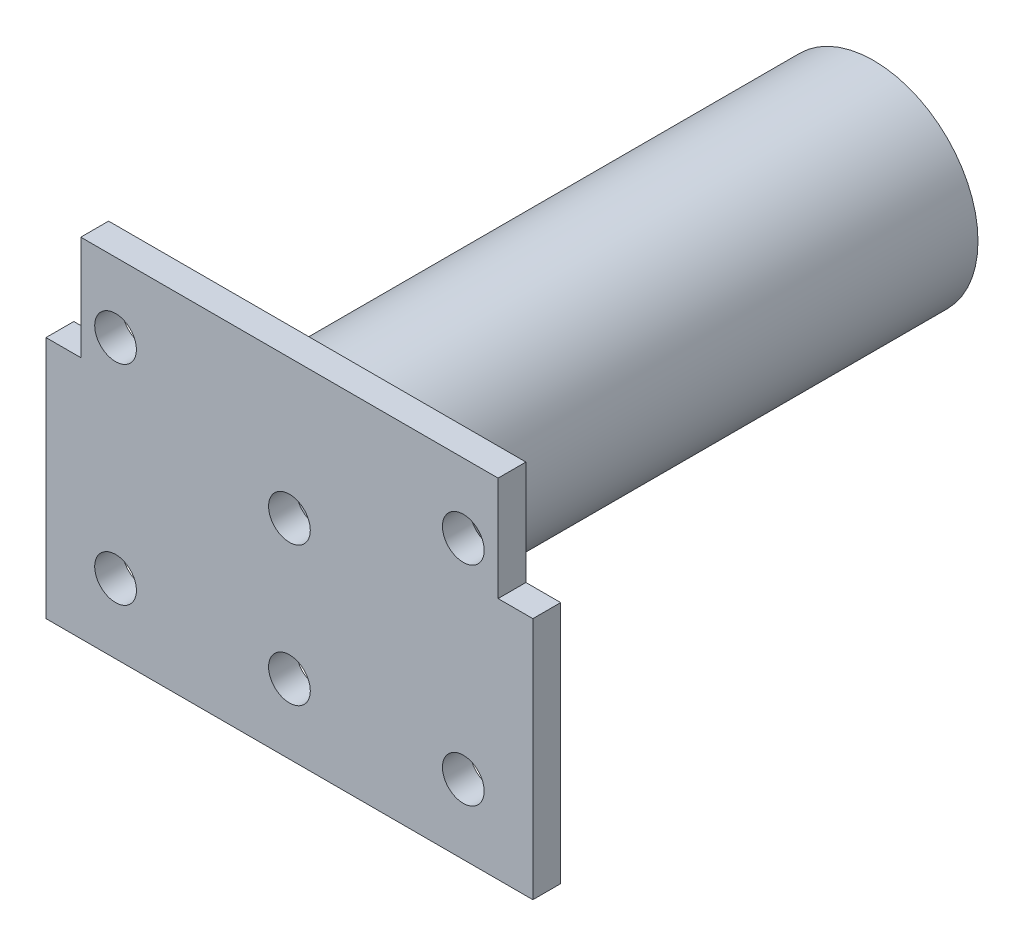
ISO-10303-21;
HEADER;
FILE_DESCRIPTION(('STEP AP214'),'2;1');
FILE_NAME('part.step','',(''),(''),'','','');
FILE_SCHEMA(('AUTOMOTIVE_DESIGN { 1 0 10303 214 1 1 1 1 }'));
ENDSEC;
DATA;
#1=APPLICATION_CONTEXT('core data for automotive mechanical design processes');
#2=APPLICATION_PROTOCOL_DEFINITION('international standard','automotive_design',2000,#1);
#3=PRODUCT_CONTEXT('',#1,'mechanical');
#4=PRODUCT('Part','Part','',(#3));
#5=PRODUCT_RELATED_PRODUCT_CATEGORY('part','',(#4));
#6=PRODUCT_DEFINITION_FORMATION('','',#4);
#7=PRODUCT_DEFINITION_CONTEXT('part definition',#1,'design');
#8=PRODUCT_DEFINITION('design','',#6,#7);
#9=PRODUCT_DEFINITION_SHAPE('','',#8);
#10=(LENGTH_UNIT() NAMED_UNIT(*) SI_UNIT(.MILLI.,.METRE.));
#11=(NAMED_UNIT(*) PLANE_ANGLE_UNIT() SI_UNIT($,.RADIAN.));
#12=(NAMED_UNIT(*) SI_UNIT($,.STERADIAN.) SOLID_ANGLE_UNIT());
#13=UNCERTAINTY_MEASURE_WITH_UNIT(LENGTH_MEASURE(1.E-05),#10,'distance_accuracy_value','');
#14=(GEOMETRIC_REPRESENTATION_CONTEXT(3) GLOBAL_UNCERTAINTY_ASSIGNED_CONTEXT((#13)) GLOBAL_UNIT_ASSIGNED_CONTEXT((#10,
#11,#12)) REPRESENTATION_CONTEXT('',''));
#15=CARTESIAN_POINT('',(0.,0.,0.));
#16=DIRECTION('',(0.,0.,1.));
#17=DIRECTION('',(1.,0.,0.));
#18=AXIS2_PLACEMENT_3D('',#15,#16,#17);
#19=CARTESIAN_POINT('',(0.,0.,4.));
#20=DIRECTION('',(0.,0.,-1.));
#21=DIRECTION('',(-1.,0.,0.));
#22=AXIS2_PLACEMENT_3D('',#19,#20,#21);
#23=PLANE('',#22);
#24=CARTESIAN_POINT('',(0.,15.,4.));
#25=DIRECTION('',(0.,0.,1.));
#26=DIRECTION('',(1.,0.,0.));
#27=AXIS2_PLACEMENT_3D('',#24,#25,#26);
#28=CIRCLE('',#27,3.);
#29=CARTESIAN_POINT('',(3.,15.,4.));
#30=VERTEX_POINT('',#29);
#31=EDGE_CURVE('E196',#30,#30,#28,.T.);
#32=ORIENTED_EDGE('',*,*,#31,.F.);
#33=EDGE_LOOP('',(#32));
#34=FACE_BOUND('',#33,.T.);
#35=CARTESIAN_POINT('',(25.,25.,4.));
#36=DIRECTION('',(0.,0.,-1.));
#37=DIRECTION('',(-1.,0.,0.));
#38=AXIS2_PLACEMENT_3D('',#35,#36,#37);
#39=CIRCLE('',#38,3.);
#40=CARTESIAN_POINT('',(22.,25.,4.));
#41=VERTEX_POINT('',#40);
#42=EDGE_CURVE('E173',#41,#41,#39,.F.);
#43=ORIENTED_EDGE('',*,*,#42,.F.);
#44=EDGE_LOOP('',(#43));
#45=FACE_BOUND('',#44,.T.);
#46=CARTESIAN_POINT('',(-25.,25.,4.));
#47=DIRECTION('',(0.,0.,-1.));
#48=DIRECTION('',(-1.,0.,0.));
#49=AXIS2_PLACEMENT_3D('',#46,#47,#48);
#50=CIRCLE('',#49,3.);
#51=CARTESIAN_POINT('',(-28.,25.,4.));
#52=VERTEX_POINT('',#51);
#53=EDGE_CURVE('E176',#52,#52,#50,.F.);
#54=ORIENTED_EDGE('',*,*,#53,.F.);
#55=EDGE_LOOP('',(#54));
#56=FACE_BOUND('',#55,.T.);
#57=DIRECTION('',(1.,0.,0.));
#58=VECTOR('',#57,1.);
#59=CARTESIAN_POINT('',(30.,20.,4.));
#60=LINE('',#59,#58);
#61=CARTESIAN_POINT('',(30.,20.,4.));
#62=VERTEX_POINT('',#61);
#63=CARTESIAN_POINT('',(35.,20.,4.));
#64=VERTEX_POINT('',#63);
#65=EDGE_CURVE('E110',#62,#64,#60,.T.);
#66=ORIENTED_EDGE('',*,*,#65,.F.);
#67=DIRECTION('',(0.,-1.,0.));
#68=VECTOR('',#67,1.);
#69=CARTESIAN_POINT('',(30.,35.,4.));
#70=LINE('',#69,#68);
#71=CARTESIAN_POINT('',(30.,35.,4.));
#72=VERTEX_POINT('',#71);
#73=EDGE_CURVE('E213',#72,#62,#70,.T.);
#74=ORIENTED_EDGE('',*,*,#73,.F.);
#75=DIRECTION('',(-1.,0.,0.));
#76=VECTOR('',#75,1.);
#77=CARTESIAN_POINT('',(35.,35.,4.));
#78=LINE('',#77,#76);
#79=CARTESIAN_POINT('',(-30.,35.,4.));
#80=VERTEX_POINT('',#79);
#81=EDGE_CURVE('E161',#72,#80,#78,.T.);
#82=ORIENTED_EDGE('',*,*,#81,.T.);
#83=DIRECTION('',(0.,1.,0.));
#84=VECTOR('',#83,1.);
#85=CARTESIAN_POINT('',(-30.,35.,4.));
#86=LINE('',#85,#84);
#87=CARTESIAN_POINT('',(-30.,20.,4.));
#88=VERTEX_POINT('',#87);
#89=EDGE_CURVE('E53',#88,#80,#86,.T.);
#90=ORIENTED_EDGE('',*,*,#89,.F.);
#91=DIRECTION('',(1.,0.,0.));
#92=VECTOR('',#91,1.);
#93=CARTESIAN_POINT('',(-30.,20.,4.));
#94=LINE('',#93,#92);
#95=CARTESIAN_POINT('',(-35.,20.,4.));
#96=VERTEX_POINT('',#95);
#97=EDGE_CURVE('E124',#96,#88,#94,.T.);
#98=ORIENTED_EDGE('',*,*,#97,.F.);
#99=DIRECTION('',(0.,-1.,0.));
#100=VECTOR('',#99,1.);
#101=CARTESIAN_POINT('',(-35.,-15.,4.));
#102=LINE('',#101,#100);
#103=CARTESIAN_POINT('',(-35.,-15.,4.));
#104=VERTEX_POINT('',#103);
#105=EDGE_CURVE('E141',#96,#104,#102,.T.);
#106=ORIENTED_EDGE('',*,*,#105,.T.);
#107=DIRECTION('',(1.,0.,0.));
#108=VECTOR('',#107,1.);
#109=CARTESIAN_POINT('',(-35.,-15.,4.));
#110=LINE('',#109,#108);
#111=CARTESIAN_POINT('',(35.,-15.,4.));
#112=VERTEX_POINT('',#111);
#113=EDGE_CURVE('E137',#104,#112,#110,.T.);
#114=ORIENTED_EDGE('',*,*,#113,.T.);
#115=DIRECTION('',(0.,1.,0.));
#116=VECTOR('',#115,1.);
#117=CARTESIAN_POINT('',(35.,-15.,4.));
#118=LINE('',#117,#116);
#119=EDGE_CURVE('E140',#112,#64,#118,.T.);
#120=ORIENTED_EDGE('',*,*,#119,.T.);
#121=EDGE_LOOP('',(#66,#74,#82,#90,#98,#106,#114,#120));
#122=FACE_BOUND('',#121,.T.);
#123=CARTESIAN_POINT('',(0.,-5.,4.));
#124=DIRECTION('',(0.,0.,1.));
#125=DIRECTION('',(1.,0.,0.));
#126=AXIS2_PLACEMENT_3D('',#123,#124,#125);
#127=CIRCLE('',#126,3.);
#128=CARTESIAN_POINT('',(3.00000000000001,-5.,4.));
#129=VERTEX_POINT('',#128);
#130=EDGE_CURVE('E129',#129,#129,#127,.T.);
#131=ORIENTED_EDGE('',*,*,#130,.F.);
#132=EDGE_LOOP('',(#131));
#133=FACE_BOUND('',#132,.T.);
#134=CARTESIAN_POINT('',(25.,-5.,4.));
#135=DIRECTION('',(0.,0.,1.));
#136=DIRECTION('',(1.,0.,0.));
#137=AXIS2_PLACEMENT_3D('',#134,#135,#136);
#138=CIRCLE('',#137,3.);
#139=CARTESIAN_POINT('',(28.,-5.,4.));
#140=VERTEX_POINT('',#139);
#141=EDGE_CURVE('E150',#140,#140,#138,.T.);
#142=ORIENTED_EDGE('',*,*,#141,.F.);
#143=EDGE_LOOP('',(#142));
#144=FACE_BOUND('',#143,.T.);
#145=CARTESIAN_POINT('',(-25.,-5.,4.));
#146=DIRECTION('',(0.,0.,1.));
#147=DIRECTION('',(1.,0.,0.));
#148=AXIS2_PLACEMENT_3D('',#145,#146,#147);
#149=CIRCLE('',#148,3.);
#150=CARTESIAN_POINT('',(-22.,-5.,4.));
#151=VERTEX_POINT('',#150);
#152=EDGE_CURVE('E155',#151,#151,#149,.T.);
#153=ORIENTED_EDGE('',*,*,#152,.F.);
#154=EDGE_LOOP('',(#153));
#155=FACE_BOUND('',#154,.T.);
#156=ADVANCED_FACE('F38',(#34,#45,#56,#122,#133,#144,#155),#23,.F.);
#157=CARTESIAN_POINT('',(0.,0.,0.));
#158=DIRECTION('',(0.,0.,-1.));
#159=DIRECTION('',(-1.,0.,0.));
#160=AXIS2_PLACEMENT_3D('',#157,#158,#159);
#161=PLANE('',#160);
#162=DIRECTION('',(0.,1.,0.));
#163=VECTOR('',#162,1.);
#164=CARTESIAN_POINT('',(30.,35.,0.));
#165=LINE('',#164,#163);
#166=CARTESIAN_POINT('',(30.,20.,0.));
#167=VERTEX_POINT('',#166);
#168=CARTESIAN_POINT('',(30.,35.,0.));
#169=VERTEX_POINT('',#168);
#170=EDGE_CURVE('E61',#167,#169,#165,.T.);
#171=ORIENTED_EDGE('',*,*,#170,.F.);
#172=DIRECTION('',(-1.,0.,0.));
#173=VECTOR('',#172,1.);
#174=CARTESIAN_POINT('',(30.,20.,0.));
#175=LINE('',#174,#173);
#176=CARTESIAN_POINT('',(35.,20.,0.));
#177=VERTEX_POINT('',#176);
#178=EDGE_CURVE('E108',#177,#167,#175,.T.);
#179=ORIENTED_EDGE('',*,*,#178,.F.);
#180=DIRECTION('',(0.,1.,0.));
#181=VECTOR('',#180,1.);
#182=CARTESIAN_POINT('',(35.,-15.,0.));
#183=LINE('',#182,#181);
#184=CARTESIAN_POINT('',(35.,-15.,0.));
#185=VERTEX_POINT('',#184);
#186=EDGE_CURVE('E122',#185,#177,#183,.T.);
#187=ORIENTED_EDGE('',*,*,#186,.F.);
#188=DIRECTION('',(1.,0.,0.));
#189=VECTOR('',#188,1.);
#190=CARTESIAN_POINT('',(-35.,-15.,0.));
#191=LINE('',#190,#189);
#192=CARTESIAN_POINT('',(-35.,-15.,0.));
#193=VERTEX_POINT('',#192);
#194=EDGE_CURVE('E131',#193,#185,#191,.T.);
#195=ORIENTED_EDGE('',*,*,#194,.F.);
#196=DIRECTION('',(0.,-1.,0.));
#197=VECTOR('',#196,1.);
#198=CARTESIAN_POINT('',(-35.,-15.,0.));
#199=LINE('',#198,#197);
#200=CARTESIAN_POINT('',(-35.,20.,0.));
#201=VERTEX_POINT('',#200);
#202=EDGE_CURVE('E128',#201,#193,#199,.T.);
#203=ORIENTED_EDGE('',*,*,#202,.F.);
#204=DIRECTION('',(-1.,0.,0.));
#205=VECTOR('',#204,1.);
#206=CARTESIAN_POINT('',(-30.,20.,0.));
#207=LINE('',#206,#205);
#208=CARTESIAN_POINT('',(-30.,20.,0.));
#209=VERTEX_POINT('',#208);
#210=EDGE_CURVE('E202',#209,#201,#207,.T.);
#211=ORIENTED_EDGE('',*,*,#210,.F.);
#212=DIRECTION('',(0.,-1.,0.));
#213=VECTOR('',#212,1.);
#214=CARTESIAN_POINT('',(-30.,35.,0.));
#215=LINE('',#214,#213);
#216=CARTESIAN_POINT('',(-30.,35.,0.));
#217=VERTEX_POINT('',#216);
#218=EDGE_CURVE('E208',#217,#209,#215,.T.);
#219=ORIENTED_EDGE('',*,*,#218,.F.);
#220=DIRECTION('',(-1.,0.,0.));
#221=VECTOR('',#220,1.);
#222=CARTESIAN_POINT('',(35.,35.,0.));
#223=LINE('',#222,#221);
#224=EDGE_CURVE('E164',#169,#217,#223,.T.);
#225=ORIENTED_EDGE('',*,*,#224,.F.);
#226=EDGE_LOOP('',(#171,#179,#187,#195,#203,#211,#219,#225));
#227=FACE_BOUND('',#226,.T.);
#228=CARTESIAN_POINT('',(25.,25.,0.));
#229=DIRECTION('',(0.,0.,-1.));
#230=DIRECTION('',(-1.,0.,0.));
#231=AXIS2_PLACEMENT_3D('',#228,#229,#230);
#232=CIRCLE('',#231,3.);
#233=CARTESIAN_POINT('',(22.,25.,0.));
#234=VERTEX_POINT('',#233);
#235=EDGE_CURVE('E179',#234,#234,#232,.T.);
#236=ORIENTED_EDGE('',*,*,#235,.F.);
#237=EDGE_LOOP('',(#236));
#238=FACE_BOUND('',#237,.T.);
#239=CARTESIAN_POINT('',(-25.,25.,0.));
#240=DIRECTION('',(0.,0.,-1.));
#241=DIRECTION('',(-1.,0.,0.));
#242=AXIS2_PLACEMENT_3D('',#239,#240,#241);
#243=CIRCLE('',#242,3.);
#244=CARTESIAN_POINT('',(-28.,25.,0.));
#245=VERTEX_POINT('',#244);
#246=EDGE_CURVE('E180',#245,#245,#243,.T.);
#247=ORIENTED_EDGE('',*,*,#246,.F.);
#248=EDGE_LOOP('',(#247));
#249=FACE_BOUND('',#248,.T.);
#250=CARTESIAN_POINT('',(0.,15.,0.));
#251=DIRECTION('',(0.,0.,-1.));
#252=DIRECTION('',(-1.,0.,0.));
#253=AXIS2_PLACEMENT_3D('',#250,#251,#252);
#254=CIRCLE('',#253,15.);
#255=CARTESIAN_POINT('',(-15.,15.,0.));
#256=VERTEX_POINT('',#255);
#257=EDGE_CURVE('E170',#256,#256,#254,.T.);
#258=ORIENTED_EDGE('',*,*,#257,.F.);
#259=EDGE_LOOP('',(#258));
#260=FACE_BOUND('',#259,.T.);
#261=CARTESIAN_POINT('',(25.,-5.,0.));
#262=DIRECTION('',(0.,0.,1.));
#263=DIRECTION('',(1.,0.,0.));
#264=AXIS2_PLACEMENT_3D('',#261,#262,#263);
#265=CIRCLE('',#264,3.);
#266=CARTESIAN_POINT('',(28.,-5.,0.));
#267=VERTEX_POINT('',#266);
#268=EDGE_CURVE('E152',#267,#267,#265,.T.);
#269=ORIENTED_EDGE('',*,*,#268,.T.);
#270=EDGE_LOOP('',(#269));
#271=FACE_BOUND('',#270,.T.);
#272=CARTESIAN_POINT('',(0.,-5.,0.));
#273=DIRECTION('',(0.,0.,1.));
#274=DIRECTION('',(1.,0.,0.));
#275=AXIS2_PLACEMENT_3D('',#272,#273,#274);
#276=CIRCLE('',#275,3.);
#277=CARTESIAN_POINT('',(3.00000000000001,-5.,0.));
#278=VERTEX_POINT('',#277);
#279=EDGE_CURVE('E134',#278,#278,#276,.T.);
#280=ORIENTED_EDGE('',*,*,#279,.T.);
#281=EDGE_LOOP('',(#280));
#282=FACE_BOUND('',#281,.T.);
#283=CARTESIAN_POINT('',(-25.,-5.,0.));
#284=DIRECTION('',(0.,0.,1.));
#285=DIRECTION('',(1.,0.,0.));
#286=AXIS2_PLACEMENT_3D('',#283,#284,#285);
#287=CIRCLE('',#286,3.);
#288=CARTESIAN_POINT('',(-22.,-5.,0.));
#289=VERTEX_POINT('',#288);
#290=EDGE_CURVE('E158',#289,#289,#287,.T.);
#291=ORIENTED_EDGE('',*,*,#290,.T.);
#292=EDGE_LOOP('',(#291));
#293=FACE_BOUND('',#292,.T.);
#294=ADVANCED_FACE('F119',(#227,#238,#249,#260,#271,#282,#293),#161,.T.);
#295=CARTESIAN_POINT('',(35.,-15.,4.));
#296=DIRECTION('',(-1.,0.,0.));
#297=DIRECTION('',(0.,0.,1.));
#298=AXIS2_PLACEMENT_3D('',#295,#296,#297);
#299=PLANE('',#298);
#300=ORIENTED_EDGE('',*,*,#186,.T.);
#301=DIRECTION('',(0.,0.,-1.));
#302=VECTOR('',#301,1.);
#303=CARTESIAN_POINT('',(35.,20.,19.8113883008419));
#304=LINE('',#303,#302);
#305=EDGE_CURVE('E104',#64,#177,#304,.T.);
#306=ORIENTED_EDGE('',*,*,#305,.F.);
#307=ORIENTED_EDGE('',*,*,#119,.F.);
#308=DIRECTION('',(0.,0.,-1.));
#309=VECTOR('',#308,1.);
#310=CARTESIAN_POINT('',(35.,-15.,4.));
#311=LINE('',#310,#309);
#312=EDGE_CURVE('E46',#112,#185,#311,.T.);
#313=ORIENTED_EDGE('',*,*,#312,.T.);
#314=EDGE_LOOP('',(#300,#306,#307,#313));
#315=FACE_BOUND('',#314,.T.);
#316=ADVANCED_FACE('F40',(#315),#299,.F.);
#317=CARTESIAN_POINT('',(-35.,-15.,4.));
#318=DIRECTION('',(1.,0.,0.));
#319=DIRECTION('',(0.,0.,-1.));
#320=AXIS2_PLACEMENT_3D('',#317,#318,#319);
#321=PLANE('',#320);
#322=ORIENTED_EDGE('',*,*,#105,.F.);
#323=DIRECTION('',(0.,0.,-1.));
#324=VECTOR('',#323,1.);
#325=CARTESIAN_POINT('',(-35.,20.,19.8113883008419));
#326=LINE('',#325,#324);
#327=EDGE_CURVE('E204',#96,#201,#326,.T.);
#328=ORIENTED_EDGE('',*,*,#327,.T.);
#329=ORIENTED_EDGE('',*,*,#202,.T.);
#330=DIRECTION('',(0.,0.,-1.));
#331=VECTOR('',#330,1.);
#332=CARTESIAN_POINT('',(-35.,-15.,4.));
#333=LINE('',#332,#331);
#334=EDGE_CURVE('E11',#104,#193,#333,.T.);
#335=ORIENTED_EDGE('',*,*,#334,.F.);
#336=EDGE_LOOP('',(#322,#328,#329,#335));
#337=FACE_BOUND('',#336,.T.);
#338=ADVANCED_FACE('F245',(#337),#321,.F.);
#339=CARTESIAN_POINT('',(-35.,-15.,4.));
#340=DIRECTION('',(0.,1.,0.));
#341=DIRECTION('',(0.,0.,1.));
#342=AXIS2_PLACEMENT_3D('',#339,#340,#341);
#343=PLANE('',#342);
#344=ORIENTED_EDGE('',*,*,#194,.T.);
#345=ORIENTED_EDGE('',*,*,#312,.F.);
#346=ORIENTED_EDGE('',*,*,#113,.F.);
#347=ORIENTED_EDGE('',*,*,#334,.T.);
#348=EDGE_LOOP('',(#344,#345,#346,#347));
#349=FACE_BOUND('',#348,.T.);
#350=ADVANCED_FACE('F248',(#349),#343,.F.);
#351=CARTESIAN_POINT('',(0.,-5.,4.));
#352=DIRECTION('',(0.,0.,-1.));
#353=DIRECTION('',(-1.,0.,0.));
#354=AXIS2_PLACEMENT_3D('',#351,#352,#353);
#355=CYLINDRICAL_SURFACE('',#354,3.);
#356=ORIENTED_EDGE('',*,*,#130,.T.);
#357=EDGE_LOOP('',(#356));
#358=FACE_BOUND('',#357,.T.);
#359=ORIENTED_EDGE('',*,*,#279,.F.);
#360=EDGE_LOOP('',(#359));
#361=FACE_BOUND('',#360,.T.);
#362=ADVANCED_FACE('F250',(#358,#361),#355,.F.);
#363=CARTESIAN_POINT('',(25.,-5.,4.));
#364=DIRECTION('',(0.,0.,-1.));
#365=DIRECTION('',(-1.,0.,0.));
#366=AXIS2_PLACEMENT_3D('',#363,#364,#365);
#367=CYLINDRICAL_SURFACE('',#366,3.);
#368=ORIENTED_EDGE('',*,*,#141,.T.);
#369=EDGE_LOOP('',(#368));
#370=FACE_BOUND('',#369,.T.);
#371=ORIENTED_EDGE('',*,*,#268,.F.);
#372=EDGE_LOOP('',(#371));
#373=FACE_BOUND('',#372,.T.);
#374=ADVANCED_FACE('F236',(#370,#373),#367,.F.);
#375=CARTESIAN_POINT('',(-25.,-5.,4.));
#376=DIRECTION('',(0.,0.,-1.));
#377=DIRECTION('',(-1.,0.,0.));
#378=AXIS2_PLACEMENT_3D('',#375,#376,#377);
#379=CYLINDRICAL_SURFACE('',#378,3.);
#380=ORIENTED_EDGE('',*,*,#152,.T.);
#381=EDGE_LOOP('',(#380));
#382=FACE_BOUND('',#381,.T.);
#383=ORIENTED_EDGE('',*,*,#290,.F.);
#384=EDGE_LOOP('',(#383));
#385=FACE_BOUND('',#384,.T.);
#386=ADVANCED_FACE('F232',(#382,#385),#379,.F.);
#387=CARTESIAN_POINT('',(35.,35.,4.));
#388=DIRECTION('',(0.,-1.,0.));
#389=DIRECTION('',(0.,0.,-1.));
#390=AXIS2_PLACEMENT_3D('',#387,#388,#389);
#391=PLANE('',#390);
#392=ORIENTED_EDGE('',*,*,#81,.F.);
#393=DIRECTION('',(0.,0.,-1.));
#394=VECTOR('',#393,1.);
#395=CARTESIAN_POINT('',(30.,35.,19.8113883008419));
#396=LINE('',#395,#394);
#397=EDGE_CURVE('E216',#72,#169,#396,.T.);
#398=ORIENTED_EDGE('',*,*,#397,.T.);
#399=ORIENTED_EDGE('',*,*,#224,.T.);
#400=DIRECTION('',(0.,0.,-1.));
#401=VECTOR('',#400,1.);
#402=CARTESIAN_POINT('',(-30.,35.,19.8113883008419));
#403=LINE('',#402,#401);
#404=EDGE_CURVE('E199',#80,#217,#403,.T.);
#405=ORIENTED_EDGE('',*,*,#404,.F.);
#406=EDGE_LOOP('',(#392,#398,#399,#405));
#407=FACE_BOUND('',#406,.T.);
#408=ADVANCED_FACE('F235',(#407),#391,.F.);
#409=CARTESIAN_POINT('',(0.,15.,-80.));
#410=DIRECTION('',(0.,0.,1.));
#411=DIRECTION('',(1.,0.,0.));
#412=AXIS2_PLACEMENT_3D('',#409,#410,#411);
#413=CYLINDRICAL_SURFACE('',#412,15.);
#414=CARTESIAN_POINT('',(0.,15.,-80.));
#415=DIRECTION('',(0.,0.,-1.));
#416=DIRECTION('',(-1.,0.,0.));
#417=AXIS2_PLACEMENT_3D('',#414,#415,#416);
#418=CIRCLE('',#417,15.);
#419=CARTESIAN_POINT('',(-15.,15.,-80.));
#420=VERTEX_POINT('',#419);
#421=EDGE_CURVE('E167',#420,#420,#418,.T.);
#422=ORIENTED_EDGE('',*,*,#421,.F.);
#423=EDGE_LOOP('',(#422));
#424=FACE_BOUND('',#423,.T.);
#425=ORIENTED_EDGE('',*,*,#257,.T.);
#426=EDGE_LOOP('',(#425));
#427=FACE_BOUND('',#426,.T.);
#428=ADVANCED_FACE('F264',(#424,#427),#413,.T.);
#429=CARTESIAN_POINT('',(0.,15.,-80.));
#430=DIRECTION('',(0.,0.,-1.));
#431=DIRECTION('',(-1.,0.,0.));
#432=AXIS2_PLACEMENT_3D('',#429,#430,#431);
#433=PLANE('',#432);
#434=CARTESIAN_POINT('',(0.,15.,-80.));
#435=DIRECTION('',(0.,0.,-1.));
#436=DIRECTION('',(-1.,0.,0.));
#437=AXIS2_PLACEMENT_3D('',#434,#435,#436);
#438=CIRCLE('',#437,13.5);
#439=CARTESIAN_POINT('',(-13.5,15.,-80.));
#440=VERTEX_POINT('',#439);
#441=EDGE_CURVE('E190',#440,#440,#438,.T.);
#442=ORIENTED_EDGE('',*,*,#441,.F.);
#443=EDGE_LOOP('',(#442));
#444=FACE_BOUND('',#443,.T.);
#445=ORIENTED_EDGE('',*,*,#421,.T.);
#446=EDGE_LOOP('',(#445));
#447=FACE_BOUND('',#446,.T.);
#448=ADVANCED_FACE('F269',(#444,#447),#433,.T.);
#449=CARTESIAN_POINT('',(-25.,25.,12.4852813742386));
#450=DIRECTION('',(0.,0.,-1.));
#451=DIRECTION('',(-1.,0.,0.));
#452=AXIS2_PLACEMENT_3D('',#449,#450,#451);
#453=CYLINDRICAL_SURFACE('',#452,3.);
#454=ORIENTED_EDGE('',*,*,#53,.T.);
#455=EDGE_LOOP('',(#454));
#456=FACE_BOUND('',#455,.T.);
#457=ORIENTED_EDGE('',*,*,#246,.T.);
#458=EDGE_LOOP('',(#457));
#459=FACE_BOUND('',#458,.T.);
#460=ADVANCED_FACE('F308',(#456,#459),#453,.F.);
#461=CARTESIAN_POINT('',(25.,25.,12.4852813742386));
#462=DIRECTION('',(0.,0.,-1.));
#463=DIRECTION('',(-1.,0.,0.));
#464=AXIS2_PLACEMENT_3D('',#461,#462,#463);
#465=CYLINDRICAL_SURFACE('',#464,3.);
#466=ORIENTED_EDGE('',*,*,#42,.T.);
#467=EDGE_LOOP('',(#466));
#468=FACE_BOUND('',#467,.T.);
#469=ORIENTED_EDGE('',*,*,#235,.T.);
#470=EDGE_LOOP('',(#469));
#471=FACE_BOUND('',#470,.T.);
#472=ADVANCED_FACE('F313',(#468,#471),#465,.F.);
#473=CARTESIAN_POINT('',(0.,15.,38.1837661840736));
#474=DIRECTION('',(0.,0.,-1.));
#475=DIRECTION('',(-1.,0.,0.));
#476=AXIS2_PLACEMENT_3D('',#473,#474,#475);
#477=CYLINDRICAL_SURFACE('',#476,13.5);
#478=CARTESIAN_POINT('',(0.,15.,0.));
#479=DIRECTION('',(0.,0.,-1.));
#480=DIRECTION('',(-1.,0.,0.));
#481=AXIS2_PLACEMENT_3D('',#478,#479,#480);
#482=CIRCLE('',#481,13.5);
#483=CARTESIAN_POINT('',(-13.5,15.,0.));
#484=VERTEX_POINT('',#483);
#485=EDGE_CURVE('E183',#484,#484,#482,.F.);
#486=CARTESIAN_POINT('',(-13.5,15.,0.));
#487=CARTESIAN_POINT('',(-13.5,15.,-0.833333333333327));
#488=CARTESIAN_POINT('',(-13.5,15.,-1.66666666666666));
#489=CARTESIAN_POINT('',(-13.5,15.,-3.33333333333333));
#490=CARTESIAN_POINT('',(-13.5,15.,-4.16666666666666));
#491=CARTESIAN_POINT('',(-13.5,15.,-5.83333333333333));
#492=CARTESIAN_POINT('',(-13.5,15.,-6.66666666666666));
#493=CARTESIAN_POINT('',(-13.5,15.,-8.33333333333333));
#494=CARTESIAN_POINT('',(-13.5,15.,-9.16666666666666));
#495=CARTESIAN_POINT('',(-13.5,15.,-10.8333333333333));
#496=CARTESIAN_POINT('',(-13.5,15.,-11.6666666666667));
#497=CARTESIAN_POINT('',(-13.5,15.,-13.3333333333333));
#498=CARTESIAN_POINT('',(-13.5,15.,-14.1666666666667));
#499=CARTESIAN_POINT('',(-13.5,15.,-15.8333333333333));
#500=CARTESIAN_POINT('',(-13.5,15.,-16.6666666666667));
#501=CARTESIAN_POINT('',(-13.5,15.,-18.3333333333333));
#502=CARTESIAN_POINT('',(-13.5,15.,-19.1666666666667));
#503=CARTESIAN_POINT('',(-13.5,15.,-20.8333333333333));
#504=CARTESIAN_POINT('',(-13.5,15.,-21.6666666666667));
#505=CARTESIAN_POINT('',(-13.5,15.,-23.3333333333333));
#506=CARTESIAN_POINT('',(-13.5,15.,-24.1666666666667));
#507=CARTESIAN_POINT('',(-13.5,15.,-25.8333333333333));
#508=CARTESIAN_POINT('',(-13.5,15.,-26.6666666666667));
#509=CARTESIAN_POINT('',(-13.5,15.,-28.3333333333333));
#510=CARTESIAN_POINT('',(-13.5,15.,-29.1666666666667));
#511=CARTESIAN_POINT('',(-13.5,15.,-30.8333333333333));
#512=CARTESIAN_POINT('',(-13.5,15.,-31.6666666666667));
#513=CARTESIAN_POINT('',(-13.5,15.,-33.3333333333333));
#514=CARTESIAN_POINT('',(-13.5,15.,-34.1666666666667));
#515=CARTESIAN_POINT('',(-13.5,15.,-35.8333333333333));
#516=CARTESIAN_POINT('',(-13.5,15.,-36.6666666666667));
#517=CARTESIAN_POINT('',(-13.5,15.,-38.3333333333333));
#518=CARTESIAN_POINT('',(-13.5,15.,-39.1666666666667));
#519=CARTESIAN_POINT('',(-13.5,15.,-40.8333333333333));
#520=CARTESIAN_POINT('',(-13.5,15.,-41.6666666666667));
#521=CARTESIAN_POINT('',(-13.5,15.,-43.3333333333333));
#522=CARTESIAN_POINT('',(-13.5,15.,-44.1666666666667));
#523=CARTESIAN_POINT('',(-13.5,15.,-45.8333333333333));
#524=CARTESIAN_POINT('',(-13.5,15.,-46.6666666666667));
#525=CARTESIAN_POINT('',(-13.5,15.,-48.3333333333333));
#526=CARTESIAN_POINT('',(-13.5,15.,-49.1666666666667));
#527=CARTESIAN_POINT('',(-13.5,15.,-50.8333333333333));
#528=CARTESIAN_POINT('',(-13.5,15.,-51.6666666666667));
#529=CARTESIAN_POINT('',(-13.5,15.,-53.3333333333333));
#530=CARTESIAN_POINT('',(-13.5,15.,-54.1666666666667));
#531=CARTESIAN_POINT('',(-13.5,15.,-55.8333333333333));
#532=CARTESIAN_POINT('',(-13.5,15.,-56.6666666666667));
#533=CARTESIAN_POINT('',(-13.5,15.,-58.3333333333333));
#534=CARTESIAN_POINT('',(-13.5,15.,-59.1666666666667));
#535=CARTESIAN_POINT('',(-13.5,15.,-60.8333333333333));
#536=CARTESIAN_POINT('',(-13.5,15.,-61.6666666666667));
#537=CARTESIAN_POINT('',(-13.5,15.,-63.3333333333333));
#538=CARTESIAN_POINT('',(-13.5,15.,-64.1666666666667));
#539=CARTESIAN_POINT('',(-13.5,15.,-65.8333333333333));
#540=CARTESIAN_POINT('',(-13.5,15.,-66.6666666666667));
#541=CARTESIAN_POINT('',(-13.5,15.,-68.3333333333333));
#542=CARTESIAN_POINT('',(-13.5,15.,-69.1666666666667));
#543=CARTESIAN_POINT('',(-13.5,15.,-70.8333333333333));
#544=CARTESIAN_POINT('',(-13.5,15.,-71.6666666666667));
#545=CARTESIAN_POINT('',(-13.5,15.,-73.3333333333333));
#546=CARTESIAN_POINT('',(-13.5,15.,-74.1666666666667));
#547=CARTESIAN_POINT('',(-13.5,15.,-75.8333333333333));
#548=CARTESIAN_POINT('',(-13.5,15.,-76.6666666666667));
#549=CARTESIAN_POINT('',(-13.5,15.,-78.3333333333333));
#550=CARTESIAN_POINT('',(-13.5,15.,-79.1666666666667));
#551=CARTESIAN_POINT('',(-13.5,15.,-80.));
#552=B_SPLINE_CURVE_WITH_KNOTS('',3,(#486,#487,#488,#489,#490,#491,#492,#493,#494,#495,#496,
#497,#498,#499,#500,#501,#502,#503,#504,#505,#506,#507,#508,#509,#510,#511,#512,#513,#514,#515,
#516,#517,#518,#519,#520,#521,#522,#523,#524,#525,#526,#527,#528,#529,#530,#531,#532,#533,#534,
#535,#536,#537,#538,#539,#540,#541,#542,#543,#544,#545,#546,#547,#548,#549,#550,#551),
.UNSPECIFIED.,.F.,.F.,(4,2,2,2,2,2,2,2,2,2,2,2,2,2,2,2,2,2,2,2,2,2,2,2,2,2,2,2,2,2,2,2,4),(0.,
2.5,5.,7.5,10.,12.5,15.,17.5,20.,22.5,25.,27.5,30.,32.5,35.,37.5,40.,42.5,45.,47.5,50.,52.5,55.,
57.5,60.,62.5,65.,67.5,70.,72.5,75.,77.5,80.),.UNSPECIFIED.);
#553=EDGE_CURVE('BSEAM323',#484,#440,#552,.T.);
#554=ORIENTED_EDGE('',*,*,#485,.T.);
#555=ORIENTED_EDGE('',*,*,#441,.T.);
#556=ORIENTED_EDGE('',*,*,#553,.T.);
#557=ORIENTED_EDGE('',*,*,#553,.F.);
#558=EDGE_LOOP('',(#554,#556,#555,#557));
#559=FACE_BOUND('',#558,.T.);
#560=ADVANCED_FACE('F323',(#559),#477,.F.);
#561=CARTESIAN_POINT('',(0.,0.,0.));
#562=DIRECTION('',(0.,0.,-1.));
#563=DIRECTION('',(-1.,0.,0.));
#564=AXIS2_PLACEMENT_3D('',#561,#562,#563);
#565=PLANE('',#564);
#566=CARTESIAN_POINT('',(0.,15.,0.));
#567=DIRECTION('',(0.,0.,-1.));
#568=DIRECTION('',(-1.,0.,0.));
#569=AXIS2_PLACEMENT_3D('',#566,#567,#568);
#570=CIRCLE('',#569,3.);
#571=CARTESIAN_POINT('',(3.,15.,0.));
#572=VERTEX_POINT('',#571);
#573=EDGE_CURVE('E193',#572,#572,#570,.F.);
#574=ORIENTED_EDGE('',*,*,#573,.T.);
#575=EDGE_LOOP('',(#574));
#576=FACE_BOUND('',#575,.T.);
#577=ORIENTED_EDGE('',*,*,#485,.F.);
#578=EDGE_LOOP('',(#577));
#579=FACE_BOUND('',#578,.T.);
#580=ADVANCED_FACE('F339',(#576,#579),#565,.T.);
#581=CARTESIAN_POINT('',(0.,15.,-8.48528137423857));
#582=DIRECTION('',(0.,0.,1.));
#583=DIRECTION('',(1.,0.,0.));
#584=AXIS2_PLACEMENT_3D('',#581,#582,#583);
#585=CYLINDRICAL_SURFACE('',#584,3.);
#586=CARTESIAN_POINT('',(3.,15.,4.));
#587=CARTESIAN_POINT('',(3.,15.,3.95833333333333));
#588=CARTESIAN_POINT('',(3.,15.,3.91666666666666));
#589=CARTESIAN_POINT('',(3.,15.,3.83333333333333));
#590=CARTESIAN_POINT('',(3.,15.,3.79166666666667));
#591=CARTESIAN_POINT('',(3.,15.,3.70833333333333));
#592=CARTESIAN_POINT('',(3.,15.,3.66666666666666));
#593=CARTESIAN_POINT('',(3.,15.,3.58333333333333));
#594=CARTESIAN_POINT('',(3.,15.,3.54166666666666));
#595=CARTESIAN_POINT('',(3.,15.,3.45833333333333));
#596=CARTESIAN_POINT('',(3.,15.,3.41666666666667));
#597=CARTESIAN_POINT('',(3.,15.,3.33333333333333));
#598=CARTESIAN_POINT('',(3.,15.,3.29166666666667));
#599=CARTESIAN_POINT('',(3.,15.,3.20833333333333));
#600=CARTESIAN_POINT('',(3.,15.,3.16666666666667));
#601=CARTESIAN_POINT('',(3.,15.,3.08333333333333));
#602=CARTESIAN_POINT('',(3.,15.,3.04166666666667));
#603=CARTESIAN_POINT('',(3.,15.,2.95833333333333));
#604=CARTESIAN_POINT('',(3.,15.,2.91666666666667));
#605=CARTESIAN_POINT('',(3.,15.,2.83333333333333));
#606=CARTESIAN_POINT('',(3.,15.,2.79166666666667));
#607=CARTESIAN_POINT('',(3.,15.,2.70833333333333));
#608=CARTESIAN_POINT('',(3.,15.,2.66666666666667));
#609=CARTESIAN_POINT('',(3.,15.,2.58333333333333));
#610=CARTESIAN_POINT('',(3.,15.,2.54166666666667));
#611=CARTESIAN_POINT('',(3.,15.,2.45833333333333));
#612=CARTESIAN_POINT('',(3.,15.,2.41666666666667));
#613=CARTESIAN_POINT('',(3.,15.,2.33333333333333));
#614=CARTESIAN_POINT('',(3.,15.,2.29166666666667));
#615=CARTESIAN_POINT('',(3.,15.,2.20833333333333));
#616=CARTESIAN_POINT('',(3.,15.,2.16666666666667));
#617=CARTESIAN_POINT('',(3.,15.,2.08333333333333));
#618=CARTESIAN_POINT('',(3.,15.,2.04166666666667));
#619=CARTESIAN_POINT('',(3.,15.,1.95833333333333));
#620=CARTESIAN_POINT('',(3.,15.,1.91666666666667));
#621=CARTESIAN_POINT('',(3.,15.,1.83333333333333));
#622=CARTESIAN_POINT('',(3.,15.,1.79166666666667));
#623=CARTESIAN_POINT('',(3.,15.,1.70833333333333));
#624=CARTESIAN_POINT('',(3.,15.,1.66666666666667));
#625=CARTESIAN_POINT('',(3.,15.,1.58333333333333));
#626=CARTESIAN_POINT('',(3.,15.,1.54166666666667));
#627=CARTESIAN_POINT('',(3.,15.,1.45833333333333));
#628=CARTESIAN_POINT('',(3.,15.,1.41666666666667));
#629=CARTESIAN_POINT('',(3.,15.,1.33333333333333));
#630=CARTESIAN_POINT('',(3.,15.,1.29166666666667));
#631=CARTESIAN_POINT('',(3.,15.,1.20833333333333));
#632=CARTESIAN_POINT('',(3.,15.,1.16666666666667));
#633=CARTESIAN_POINT('',(3.,15.,1.08333333333333));
#634=CARTESIAN_POINT('',(3.,15.,1.04166666666667));
#635=CARTESIAN_POINT('',(3.,15.,0.958333333333334));
#636=CARTESIAN_POINT('',(3.,15.,0.916666666666668));
#637=CARTESIAN_POINT('',(3.,15.,0.833333333333334));
#638=CARTESIAN_POINT('',(3.,15.,0.791666666666667));
#639=CARTESIAN_POINT('',(3.,15.,0.708333333333335));
#640=CARTESIAN_POINT('',(3.,15.,0.666666666666668));
#641=CARTESIAN_POINT('',(3.,15.,0.583333333333336));
#642=CARTESIAN_POINT('',(3.,15.,0.541666666666669));
#643=CARTESIAN_POINT('',(3.,15.,0.458333333333335));
#644=CARTESIAN_POINT('',(3.,15.,0.416666666666669));
#645=CARTESIAN_POINT('',(3.,15.,0.333333333333335));
#646=CARTESIAN_POINT('',(3.,15.,0.291666666666669));
#647=CARTESIAN_POINT('',(3.,15.,0.208333333333335));
#648=CARTESIAN_POINT('',(3.,15.,0.166666666666669));
#649=CARTESIAN_POINT('',(3.,15.,0.0833333333333351));
#650=CARTESIAN_POINT('',(3.,15.,0.0416666666666684));
#651=CARTESIAN_POINT('',(3.,15.,0.));
#652=B_SPLINE_CURVE_WITH_KNOTS('',3,(#586,#587,#588,#589,#590,#591,#592,#593,#594,#595,#596,
#597,#598,#599,#600,#601,#602,#603,#604,#605,#606,#607,#608,#609,#610,#611,#612,#613,#614,#615,
#616,#617,#618,#619,#620,#621,#622,#623,#624,#625,#626,#627,#628,#629,#630,#631,#632,#633,#634,
#635,#636,#637,#638,#639,#640,#641,#642,#643,#644,#645,#646,#647,#648,#649,#650,#651),
.UNSPECIFIED.,.F.,.F.,(4,2,2,2,2,2,2,2,2,2,2,2,2,2,2,2,2,2,2,2,2,2,2,2,2,2,2,2,2,2,2,2,4),(0.,
0.125,0.25,0.375,0.5,0.624999999999999,0.749999999999999,0.874999999999999,0.999999999999999,
1.125,1.25,1.375,1.5,1.625,1.75,1.875,2.,2.125,2.25,2.375,2.5,2.625,2.75,2.875,3.,3.125,3.25,
3.375,3.5,3.625,3.75,3.875,4.),.UNSPECIFIED.);
#653=EDGE_CURVE('BSEAM349',#30,#572,#652,.T.);
#654=ORIENTED_EDGE('',*,*,#31,.T.);
#655=ORIENTED_EDGE('',*,*,#573,.F.);
#656=ORIENTED_EDGE('',*,*,#653,.T.);
#657=ORIENTED_EDGE('',*,*,#653,.F.);
#658=EDGE_LOOP('',(#654,#656,#655,#657));
#659=FACE_BOUND('',#658,.T.);
#660=ADVANCED_FACE('F349',(#659),#585,.F.);
#661=CARTESIAN_POINT('',(-30.,20.,19.8113883008419));
#662=DIRECTION('',(0.,-1.,0.));
#663=DIRECTION('',(0.,0.,-1.));
#664=AXIS2_PLACEMENT_3D('',#661,#662,#663);
#665=PLANE('',#664);
#666=ORIENTED_EDGE('',*,*,#97,.T.);
#667=DIRECTION('',(0.,0.,-1.));
#668=VECTOR('',#667,1.);
#669=CARTESIAN_POINT('',(-30.,20.,19.8113883008419));
#670=LINE('',#669,#668);
#671=EDGE_CURVE('E201',#88,#209,#670,.T.);
#672=ORIENTED_EDGE('',*,*,#671,.T.);
#673=ORIENTED_EDGE('',*,*,#210,.T.);
#674=ORIENTED_EDGE('',*,*,#327,.F.);
#675=EDGE_LOOP('',(#666,#672,#673,#674));
#676=FACE_BOUND('',#675,.T.);
#677=ADVANCED_FACE('F260',(#676),#665,.F.);
#678=CARTESIAN_POINT('',(-30.,35.,19.8113883008419));
#679=DIRECTION('',(1.,0.,0.));
#680=DIRECTION('',(0.,1.,0.));
#681=AXIS2_PLACEMENT_3D('',#678,#679,#680);
#682=PLANE('',#681);
#683=ORIENTED_EDGE('',*,*,#89,.T.);
#684=ORIENTED_EDGE('',*,*,#404,.T.);
#685=ORIENTED_EDGE('',*,*,#218,.T.);
#686=ORIENTED_EDGE('',*,*,#671,.F.);
#687=EDGE_LOOP('',(#683,#684,#685,#686));
#688=FACE_BOUND('',#687,.T.);
#689=ADVANCED_FACE('F261',(#688),#682,.F.);
#690=CARTESIAN_POINT('',(30.,35.,19.8113883008419));
#691=DIRECTION('',(-1.,0.,0.));
#692=DIRECTION('',(0.,-1.,0.));
#693=AXIS2_PLACEMENT_3D('',#690,#691,#692);
#694=PLANE('',#693);
#695=ORIENTED_EDGE('',*,*,#73,.T.);
#696=DIRECTION('',(0.,0.,-1.));
#697=VECTOR('',#696,1.);
#698=CARTESIAN_POINT('',(30.,20.,19.8113883008419));
#699=LINE('',#698,#697);
#700=EDGE_CURVE('E115',#62,#167,#699,.T.);
#701=ORIENTED_EDGE('',*,*,#700,.T.);
#702=ORIENTED_EDGE('',*,*,#170,.T.);
#703=ORIENTED_EDGE('',*,*,#397,.F.);
#704=EDGE_LOOP('',(#695,#701,#702,#703));
#705=FACE_BOUND('',#704,.T.);
#706=ADVANCED_FACE('F220',(#705),#694,.F.);
#707=CARTESIAN_POINT('',(30.,20.,19.8113883008419));
#708=DIRECTION('',(0.,-1.,0.));
#709=DIRECTION('',(0.,0.,-1.));
#710=AXIS2_PLACEMENT_3D('',#707,#708,#709);
#711=PLANE('',#710);
#712=ORIENTED_EDGE('',*,*,#65,.T.);
#713=ORIENTED_EDGE('',*,*,#305,.T.);
#714=ORIENTED_EDGE('',*,*,#178,.T.);
#715=ORIENTED_EDGE('',*,*,#700,.F.);
#716=EDGE_LOOP('',(#712,#713,#714,#715));
#717=FACE_BOUND('',#716,.T.);
#718=ADVANCED_FACE('F106',(#717),#711,.F.);
#719=CLOSED_SHELL('',(#156,#294,#316,#338,#350,#362,#374,#386,#408,#428,#448,#460,#472,#560,
#580,#660,#677,#689,#706,#718));
#720=MANIFOLD_SOLID_BREP('B2',#719);
#721=ADVANCED_BREP_SHAPE_REPRESENTATION('',(#18,#720),#14);
#722=SHAPE_DEFINITION_REPRESENTATION(#9,#721);
ENDSEC;
END-ISO-10303-21;
